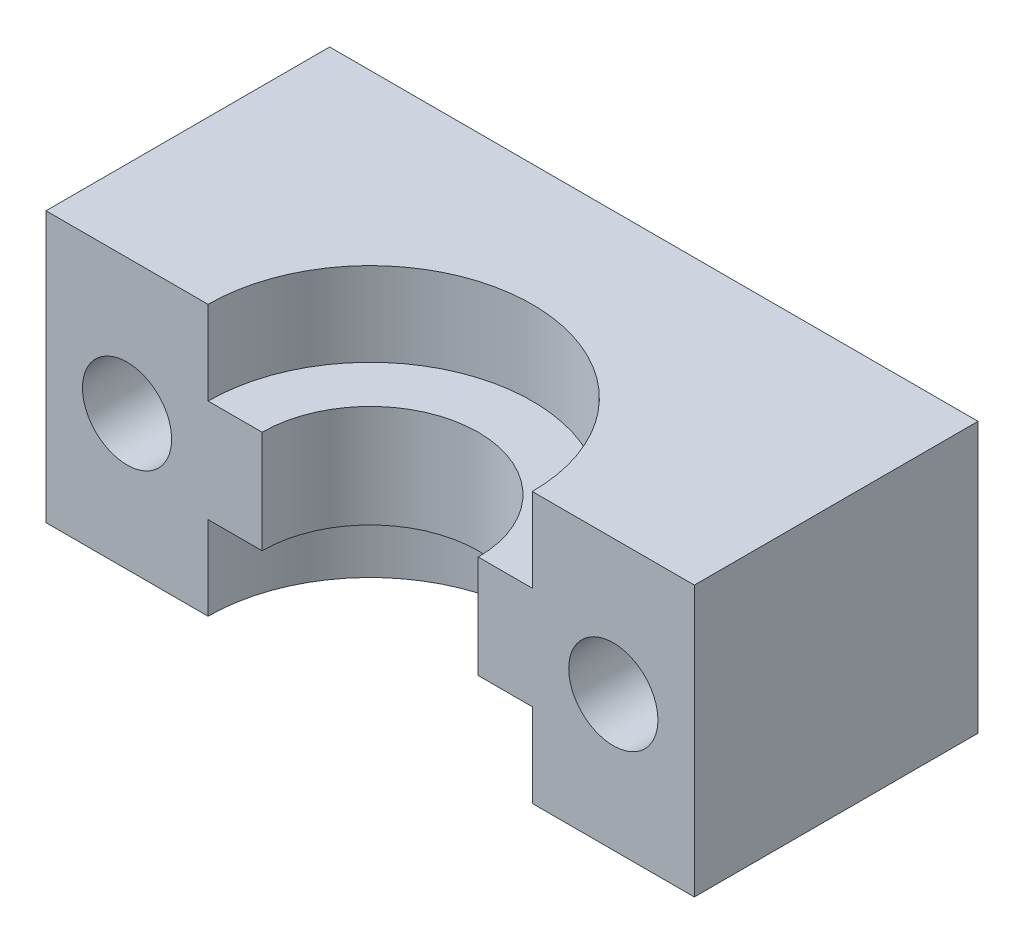
ISO-10303-21;
HEADER;
FILE_DESCRIPTION(('STEP AP214'),'2;1');
FILE_NAME('part.step','',(''),(''),'','','');
FILE_SCHEMA(('AUTOMOTIVE_DESIGN { 1 0 10303 214 1 1 1 1 }'));
ENDSEC;
DATA;
#1=APPLICATION_CONTEXT('core data for automotive mechanical design processes');
#2=APPLICATION_PROTOCOL_DEFINITION('international standard','automotive_design',2000,#1);
#3=PRODUCT_CONTEXT('',#1,'mechanical');
#4=PRODUCT('Part','Part','',(#3));
#5=PRODUCT_RELATED_PRODUCT_CATEGORY('part','',(#4));
#6=PRODUCT_DEFINITION_FORMATION('','',#4);
#7=PRODUCT_DEFINITION_CONTEXT('part definition',#1,'design');
#8=PRODUCT_DEFINITION('design','',#6,#7);
#9=PRODUCT_DEFINITION_SHAPE('','',#8);
#10=(LENGTH_UNIT() NAMED_UNIT(*) SI_UNIT(.MILLI.,.METRE.));
#11=(NAMED_UNIT(*) PLANE_ANGLE_UNIT() SI_UNIT($,.RADIAN.));
#12=(NAMED_UNIT(*) SI_UNIT($,.STERADIAN.) SOLID_ANGLE_UNIT());
#13=UNCERTAINTY_MEASURE_WITH_UNIT(LENGTH_MEASURE(1.E-05),#10,'distance_accuracy_value','');
#14=(GEOMETRIC_REPRESENTATION_CONTEXT(3) GLOBAL_UNCERTAINTY_ASSIGNED_CONTEXT((#13)) GLOBAL_UNIT_ASSIGNED_CONTEXT((#10,
#11,#12)) REPRESENTATION_CONTEXT('',''));
#15=CARTESIAN_POINT('',(0.,0.,0.));
#16=DIRECTION('',(0.,0.,1.));
#17=DIRECTION('',(1.,0.,0.));
#18=AXIS2_PLACEMENT_3D('',#15,#16,#17);
#19=CARTESIAN_POINT('',(0.,0.,10.5));
#20=DIRECTION('',(0.,0.,1.));
#21=DIRECTION('',(1.,0.,0.));
#22=AXIS2_PLACEMENT_3D('',#19,#20,#21);
#23=PLANE('',#22);
#24=DIRECTION('',(0.,-1.,0.));
#25=VECTOR('',#24,1.);
#26=CARTESIAN_POINT('',(-6.,5.06281934360466,10.5));
#27=LINE('',#26,#25);
#28=CARTESIAN_POINT('',(-6.,5.,10.5));
#29=VERTEX_POINT('',#28);
#30=CARTESIAN_POINT('',(-6.,1.9,10.5));
#31=VERTEX_POINT('',#30);
#32=EDGE_CURVE('E159',#29,#31,#27,.T.);
#33=ORIENTED_EDGE('',*,*,#32,.F.);
#34=DIRECTION('',(-1.,0.,0.));
#35=VECTOR('',#34,1.);
#36=CARTESIAN_POINT('',(-12.,5.,10.5));
#37=LINE('',#36,#35);
#38=CARTESIAN_POINT('',(-12.,5.,10.5));
#39=VERTEX_POINT('',#38);
#40=EDGE_CURVE('E180',#29,#39,#37,.T.);
#41=ORIENTED_EDGE('',*,*,#40,.T.);
#42=DIRECTION('',(0.,-1.,0.));
#43=VECTOR('',#42,1.);
#44=CARTESIAN_POINT('',(-12.,5.,10.5));
#45=LINE('',#44,#43);
#46=CARTESIAN_POINT('',(-12.,-5.,10.5));
#47=VERTEX_POINT('',#46);
#48=EDGE_CURVE('E182',#39,#47,#45,.T.);
#49=ORIENTED_EDGE('',*,*,#48,.T.);
#50=DIRECTION('',(1.,0.,0.));
#51=VECTOR('',#50,1.);
#52=CARTESIAN_POINT('',(-12.,-5.,10.5));
#53=LINE('',#52,#51);
#54=CARTESIAN_POINT('',(-6.,-5.,10.5));
#55=VERTEX_POINT('',#54);
#56=EDGE_CURVE('E184',#47,#55,#53,.T.);
#57=ORIENTED_EDGE('',*,*,#56,.T.);
#58=DIRECTION('',(0.,-1.,0.));
#59=VECTOR('',#58,1.);
#60=CARTESIAN_POINT('',(-6.,5.06281934360466,10.5));
#61=LINE('',#60,#59);
#62=CARTESIAN_POINT('',(-6.,-1.9,10.5));
#63=VERTEX_POINT('',#62);
#64=EDGE_CURVE('E49',#63,#55,#61,.T.);
#65=ORIENTED_EDGE('',*,*,#64,.F.);
#66=DIRECTION('',(-1.,0.,0.));
#67=VECTOR('',#66,1.);
#68=CARTESIAN_POINT('',(0.,-1.9,10.5));
#69=LINE('',#68,#67);
#70=CARTESIAN_POINT('',(-4.,-1.9,10.5));
#71=VERTEX_POINT('',#70);
#72=EDGE_CURVE('E134',#71,#63,#69,.T.);
#73=ORIENTED_EDGE('',*,*,#72,.F.);
#74=DIRECTION('',(0.,-1.,0.));
#75=VECTOR('',#74,1.);
#76=CARTESIAN_POINT('',(-4.,5.06281934360466,10.5));
#77=LINE('',#76,#75);
#78=CARTESIAN_POINT('',(-4.,1.9,10.5));
#79=VERTEX_POINT('',#78);
#80=EDGE_CURVE('E37',#79,#71,#77,.T.);
#81=ORIENTED_EDGE('',*,*,#80,.F.);
#82=DIRECTION('',(1.,0.,0.));
#83=VECTOR('',#82,1.);
#84=CARTESIAN_POINT('',(0.,1.9,10.5));
#85=LINE('',#84,#83);
#86=EDGE_CURVE('E11',#31,#79,#85,.T.);
#87=ORIENTED_EDGE('',*,*,#86,.F.);
#88=EDGE_LOOP('',(#33,#41,#49,#57,#65,#73,#81,#87));
#89=FACE_BOUND('',#88,.T.);
#90=CARTESIAN_POINT('',(-9.,0.,10.5));
#91=DIRECTION('',(0.,0.,1.));
#92=DIRECTION('',(1.,0.,0.));
#93=AXIS2_PLACEMENT_3D('',#90,#91,#92);
#94=CIRCLE('',#93,1.65);
#95=CARTESIAN_POINT('',(-10.65,0.,10.5));
#96=VERTEX_POINT('',#95);
#97=EDGE_CURVE('E172',#96,#96,#94,.T.);
#98=ORIENTED_EDGE('',*,*,#97,.F.);
#99=EDGE_LOOP('',(#98));
#100=FACE_BOUND('',#99,.T.);
#101=ADVANCED_FACE('F33',(#89,#100),#23,.T.);
#102=DIRECTION('',(0.,-1.,0.));
#103=VECTOR('',#102,1.);
#104=CARTESIAN_POINT('',(6.,5.06281934360466,10.5));
#105=LINE('',#104,#103);
#106=CARTESIAN_POINT('',(6.,1.9,10.5));
#107=VERTEX_POINT('',#106);
#108=CARTESIAN_POINT('',(6.,5.,10.5));
#109=VERTEX_POINT('',#108);
#110=EDGE_CURVE('E157',#107,#109,#105,.F.);
#111=ORIENTED_EDGE('',*,*,#110,.F.);
#112=CARTESIAN_POINT('',(4.,1.9,10.5));
#113=VERTEX_POINT('',#112);
#114=EDGE_CURVE('E42',#113,#107,#85,.T.);
#115=ORIENTED_EDGE('',*,*,#114,.F.);
#116=DIRECTION('',(0.,-1.,0.));
#117=VECTOR('',#116,1.);
#118=CARTESIAN_POINT('',(4.,5.06281934360466,10.5));
#119=LINE('',#118,#117);
#120=CARTESIAN_POINT('',(4.,-1.9,10.5));
#121=VERTEX_POINT('',#120);
#122=EDGE_CURVE('E142',#121,#113,#119,.F.);
#123=ORIENTED_EDGE('',*,*,#122,.F.);
#124=CARTESIAN_POINT('',(6.,-1.9,10.5));
#125=VERTEX_POINT('',#124);
#126=EDGE_CURVE('E131',#125,#121,#69,.T.);
#127=ORIENTED_EDGE('',*,*,#126,.F.);
#128=DIRECTION('',(0.,-1.,0.));
#129=VECTOR('',#128,1.);
#130=CARTESIAN_POINT('',(6.,5.06281934360466,10.5));
#131=LINE('',#130,#129);
#132=CARTESIAN_POINT('',(6.,-5.,10.5));
#133=VERTEX_POINT('',#132);
#134=EDGE_CURVE('E120',#133,#125,#131,.F.);
#135=ORIENTED_EDGE('',*,*,#134,.F.);
#136=CARTESIAN_POINT('',(12.,-5.,10.5));
#137=VERTEX_POINT('',#136);
#138=EDGE_CURVE('E58',#133,#137,#53,.T.);
#139=ORIENTED_EDGE('',*,*,#138,.T.);
#140=DIRECTION('',(0.,1.,0.));
#141=VECTOR('',#140,1.);
#142=CARTESIAN_POINT('',(12.,5.,10.5));
#143=LINE('',#142,#141);
#144=CARTESIAN_POINT('',(12.,5.,10.5));
#145=VERTEX_POINT('',#144);
#146=EDGE_CURVE('E178',#137,#145,#143,.T.);
#147=ORIENTED_EDGE('',*,*,#146,.T.);
#148=EDGE_CURVE('E88',#145,#109,#37,.T.);
#149=ORIENTED_EDGE('',*,*,#148,.T.);
#150=EDGE_LOOP('',(#111,#115,#123,#127,#135,#139,#147,#149));
#151=FACE_BOUND('',#150,.T.);
#152=CARTESIAN_POINT('',(9.,0.,10.5));
#153=DIRECTION('',(0.,0.,1.));
#154=DIRECTION('',(1.,0.,0.));
#155=AXIS2_PLACEMENT_3D('',#152,#153,#154);
#156=CIRCLE('',#155,1.65);
#157=CARTESIAN_POINT('',(7.35,0.,10.5));
#158=VERTEX_POINT('',#157);
#159=EDGE_CURVE('E166',#158,#158,#156,.T.);
#160=ORIENTED_EDGE('',*,*,#159,.F.);
#161=EDGE_LOOP('',(#160));
#162=FACE_BOUND('',#161,.T.);
#163=ADVANCED_FACE('F139',(#151,#162),#23,.T.);
#164=CARTESIAN_POINT('',(0.,0.,0.));
#165=DIRECTION('',(0.,0.,1.));
#166=DIRECTION('',(1.,0.,0.));
#167=AXIS2_PLACEMENT_3D('',#164,#165,#166);
#168=PLANE('',#167);
#169=DIRECTION('',(0.,1.,0.));
#170=VECTOR('',#169,1.);
#171=CARTESIAN_POINT('',(12.,5.,0.));
#172=LINE('',#171,#170);
#173=CARTESIAN_POINT('',(12.,-5.,0.));
#174=VERTEX_POINT('',#173);
#175=CARTESIAN_POINT('',(12.,5.,0.));
#176=VERTEX_POINT('',#175);
#177=EDGE_CURVE('E175',#174,#176,#172,.T.);
#178=ORIENTED_EDGE('',*,*,#177,.F.);
#179=DIRECTION('',(1.,0.,0.));
#180=VECTOR('',#179,1.);
#181=CARTESIAN_POINT('',(-12.,-5.,0.));
#182=LINE('',#181,#180);
#183=CARTESIAN_POINT('',(-12.,-5.,0.));
#184=VERTEX_POINT('',#183);
#185=EDGE_CURVE('E80',#184,#174,#182,.T.);
#186=ORIENTED_EDGE('',*,*,#185,.F.);
#187=DIRECTION('',(0.,-1.,0.));
#188=VECTOR('',#187,1.);
#189=CARTESIAN_POINT('',(-12.,5.,0.));
#190=LINE('',#189,#188);
#191=CARTESIAN_POINT('',(-12.,5.,0.));
#192=VERTEX_POINT('',#191);
#193=EDGE_CURVE('E192',#192,#184,#190,.T.);
#194=ORIENTED_EDGE('',*,*,#193,.F.);
#195=DIRECTION('',(-1.,0.,0.));
#196=VECTOR('',#195,1.);
#197=CARTESIAN_POINT('',(-12.,5.,0.));
#198=LINE('',#197,#196);
#199=EDGE_CURVE('E190',#176,#192,#198,.T.);
#200=ORIENTED_EDGE('',*,*,#199,.F.);
#201=EDGE_LOOP('',(#178,#186,#194,#200));
#202=FACE_BOUND('',#201,.T.);
#203=CARTESIAN_POINT('',(-9.,0.,0.));
#204=DIRECTION('',(0.,0.,1.));
#205=DIRECTION('',(1.,0.,0.));
#206=AXIS2_PLACEMENT_3D('',#203,#204,#205);
#207=CIRCLE('',#206,1.65);
#208=CARTESIAN_POINT('',(-10.65,0.,0.));
#209=VERTEX_POINT('',#208);
#210=EDGE_CURVE('E169',#209,#209,#207,.T.);
#211=ORIENTED_EDGE('',*,*,#210,.T.);
#212=EDGE_LOOP('',(#211));
#213=FACE_BOUND('',#212,.T.);
#214=CARTESIAN_POINT('',(9.,0.,0.));
#215=DIRECTION('',(0.,0.,1.));
#216=DIRECTION('',(1.,0.,0.));
#217=AXIS2_PLACEMENT_3D('',#214,#215,#216);
#218=CIRCLE('',#217,1.65);
#219=CARTESIAN_POINT('',(7.35,0.,0.));
#220=VERTEX_POINT('',#219);
#221=EDGE_CURVE('E162',#220,#220,#218,.T.);
#222=ORIENTED_EDGE('',*,*,#221,.T.);
#223=EDGE_LOOP('',(#222));
#224=FACE_BOUND('',#223,.T.);
#225=ADVANCED_FACE('F216',(#202,#213,#224),#168,.F.);
#226=CARTESIAN_POINT('',(12.,5.,10.5));
#227=DIRECTION('',(-1.,0.,0.));
#228=DIRECTION('',(0.,0.,1.));
#229=AXIS2_PLACEMENT_3D('',#226,#227,#228);
#230=PLANE('',#229);
#231=ORIENTED_EDGE('',*,*,#177,.T.);
#232=DIRECTION('',(0.,0.,-1.));
#233=VECTOR('',#232,1.);
#234=CARTESIAN_POINT('',(12.,5.,10.5));
#235=LINE('',#234,#233);
#236=EDGE_CURVE('E201',#145,#176,#235,.T.);
#237=ORIENTED_EDGE('',*,*,#236,.F.);
#238=ORIENTED_EDGE('',*,*,#146,.F.);
#239=DIRECTION('',(0.,0.,-1.));
#240=VECTOR('',#239,1.);
#241=CARTESIAN_POINT('',(12.,-5.,10.5));
#242=LINE('',#241,#240);
#243=EDGE_CURVE('E187',#137,#174,#242,.T.);
#244=ORIENTED_EDGE('',*,*,#243,.T.);
#245=EDGE_LOOP('',(#231,#237,#238,#244));
#246=FACE_BOUND('',#245,.T.);
#247=ADVANCED_FACE('F35',(#246),#230,.F.);
#248=CARTESIAN_POINT('',(-12.,5.,10.5));
#249=DIRECTION('',(0.,-1.,0.));
#250=DIRECTION('',(0.,0.,-1.));
#251=AXIS2_PLACEMENT_3D('',#248,#249,#250);
#252=PLANE('',#251);
#253=ORIENTED_EDGE('',*,*,#40,.F.);
#254=CARTESIAN_POINT('',(0.,5.,10.5));
#255=DIRECTION('',(0.,-1.,0.));
#256=DIRECTION('',(0.,0.,-1.));
#257=AXIS2_PLACEMENT_3D('',#254,#255,#256);
#258=CIRCLE('',#257,6.);
#259=EDGE_CURVE('E143',#29,#109,#258,.T.);
#260=ORIENTED_EDGE('',*,*,#259,.T.);
#261=ORIENTED_EDGE('',*,*,#148,.F.);
#262=ORIENTED_EDGE('',*,*,#236,.T.);
#263=ORIENTED_EDGE('',*,*,#199,.T.);
#264=DIRECTION('',(0.,0.,-1.));
#265=VECTOR('',#264,1.);
#266=CARTESIAN_POINT('',(-12.,5.,10.5));
#267=LINE('',#266,#265);
#268=EDGE_CURVE('E198',#39,#192,#267,.T.);
#269=ORIENTED_EDGE('',*,*,#268,.F.);
#270=EDGE_LOOP('',(#253,#260,#261,#262,#263,#269));
#271=FACE_BOUND('',#270,.T.);
#272=ADVANCED_FACE('F221',(#271),#252,.F.);
#273=CARTESIAN_POINT('',(-12.,5.,10.5));
#274=DIRECTION('',(1.,0.,0.));
#275=DIRECTION('',(0.,1.,0.));
#276=AXIS2_PLACEMENT_3D('',#273,#274,#275);
#277=PLANE('',#276);
#278=ORIENTED_EDGE('',*,*,#193,.T.);
#279=DIRECTION('',(0.,0.,-1.));
#280=VECTOR('',#279,1.);
#281=CARTESIAN_POINT('',(-12.,-5.,10.5));
#282=LINE('',#281,#280);
#283=EDGE_CURVE('E196',#47,#184,#282,.T.);
#284=ORIENTED_EDGE('',*,*,#283,.F.);
#285=ORIENTED_EDGE('',*,*,#48,.F.);
#286=ORIENTED_EDGE('',*,*,#268,.T.);
#287=EDGE_LOOP('',(#278,#284,#285,#286));
#288=FACE_BOUND('',#287,.T.);
#289=ADVANCED_FACE('F212',(#288),#277,.F.);
#290=CARTESIAN_POINT('',(-12.,-5.,10.5));
#291=DIRECTION('',(0.,1.,0.));
#292=DIRECTION('',(0.,0.,1.));
#293=AXIS2_PLACEMENT_3D('',#290,#291,#292);
#294=PLANE('',#293);
#295=ORIENTED_EDGE('',*,*,#138,.F.);
#296=CARTESIAN_POINT('',(0.,-5.,10.5));
#297=DIRECTION('',(0.,1.,0.));
#298=DIRECTION('',(0.,0.,1.));
#299=AXIS2_PLACEMENT_3D('',#296,#297,#298);
#300=CIRCLE('',#299,6.);
#301=EDGE_CURVE('E124',#133,#55,#300,.T.);
#302=ORIENTED_EDGE('',*,*,#301,.T.);
#303=ORIENTED_EDGE('',*,*,#56,.F.);
#304=ORIENTED_EDGE('',*,*,#283,.T.);
#305=ORIENTED_EDGE('',*,*,#185,.T.);
#306=ORIENTED_EDGE('',*,*,#243,.F.);
#307=EDGE_LOOP('',(#295,#302,#303,#304,#305,#306));
#308=FACE_BOUND('',#307,.T.);
#309=ADVANCED_FACE('F204',(#308),#294,.F.);
#310=CARTESIAN_POINT('',(-9.,0.,10.5));
#311=DIRECTION('',(0.,0.,-1.));
#312=DIRECTION('',(-1.,0.,0.));
#313=AXIS2_PLACEMENT_3D('',#310,#311,#312);
#314=CYLINDRICAL_SURFACE('',#313,1.65);
#315=CARTESIAN_POINT('',(-10.65,0.,10.5));
#316=CARTESIAN_POINT('',(-10.65,0.,10.390625));
#317=CARTESIAN_POINT('',(-10.65,0.,10.28125));
#318=CARTESIAN_POINT('',(-10.65,0.,10.0625));
#319=CARTESIAN_POINT('',(-10.65,0.,9.953125));
#320=CARTESIAN_POINT('',(-10.65,0.,9.734375));
#321=CARTESIAN_POINT('',(-10.65,0.,9.625));
#322=CARTESIAN_POINT('',(-10.65,0.,9.40625));
#323=CARTESIAN_POINT('',(-10.65,0.,9.296875));
#324=CARTESIAN_POINT('',(-10.65,0.,9.078125));
#325=CARTESIAN_POINT('',(-10.65,0.,8.96875));
#326=CARTESIAN_POINT('',(-10.65,0.,8.75));
#327=CARTESIAN_POINT('',(-10.65,0.,8.640625));
#328=CARTESIAN_POINT('',(-10.65,0.,8.421875));
#329=CARTESIAN_POINT('',(-10.65,0.,8.3125));
#330=CARTESIAN_POINT('',(-10.65,0.,8.09375));
#331=CARTESIAN_POINT('',(-10.65,0.,7.984375));
#332=CARTESIAN_POINT('',(-10.65,0.,7.765625));
#333=CARTESIAN_POINT('',(-10.65,0.,7.65625));
#334=CARTESIAN_POINT('',(-10.65,0.,7.4375));
#335=CARTESIAN_POINT('',(-10.65,0.,7.328125));
#336=CARTESIAN_POINT('',(-10.65,0.,7.109375));
#337=CARTESIAN_POINT('',(-10.65,0.,7.));
#338=CARTESIAN_POINT('',(-10.65,0.,6.78125));
#339=CARTESIAN_POINT('',(-10.65,0.,6.671875));
#340=CARTESIAN_POINT('',(-10.65,0.,6.453125));
#341=CARTESIAN_POINT('',(-10.65,0.,6.34375));
#342=CARTESIAN_POINT('',(-10.65,0.,6.125));
#343=CARTESIAN_POINT('',(-10.65,0.,6.015625));
#344=CARTESIAN_POINT('',(-10.65,0.,5.796875));
#345=CARTESIAN_POINT('',(-10.65,0.,5.6875));
#346=CARTESIAN_POINT('',(-10.65,0.,5.46875));
#347=CARTESIAN_POINT('',(-10.65,0.,5.359375));
#348=CARTESIAN_POINT('',(-10.65,0.,5.140625));
#349=CARTESIAN_POINT('',(-10.65,0.,5.03125));
#350=CARTESIAN_POINT('',(-10.65,0.,4.8125));
#351=CARTESIAN_POINT('',(-10.65,0.,4.703125));
#352=CARTESIAN_POINT('',(-10.65,0.,4.484375));
#353=CARTESIAN_POINT('',(-10.65,0.,4.375));
#354=CARTESIAN_POINT('',(-10.65,0.,4.15625));
#355=CARTESIAN_POINT('',(-10.65,0.,4.046875));
#356=CARTESIAN_POINT('',(-10.65,0.,3.828125));
#357=CARTESIAN_POINT('',(-10.65,0.,3.71875));
#358=CARTESIAN_POINT('',(-10.65,0.,3.5));
#359=CARTESIAN_POINT('',(-10.65,0.,3.390625));
#360=CARTESIAN_POINT('',(-10.65,0.,3.171875));
#361=CARTESIAN_POINT('',(-10.65,0.,3.0625));
#362=CARTESIAN_POINT('',(-10.65,0.,2.84375));
#363=CARTESIAN_POINT('',(-10.65,0.,2.734375));
#364=CARTESIAN_POINT('',(-10.65,0.,2.515625));
#365=CARTESIAN_POINT('',(-10.65,0.,2.40625));
#366=CARTESIAN_POINT('',(-10.65,0.,2.1875));
#367=CARTESIAN_POINT('',(-10.65,0.,2.078125));
#368=CARTESIAN_POINT('',(-10.65,0.,1.859375));
#369=CARTESIAN_POINT('',(-10.65,0.,1.75));
#370=CARTESIAN_POINT('',(-10.65,0.,1.53125));
#371=CARTESIAN_POINT('',(-10.65,0.,1.421875));
#372=CARTESIAN_POINT('',(-10.65,0.,1.203125));
#373=CARTESIAN_POINT('',(-10.65,0.,1.09375));
#374=CARTESIAN_POINT('',(-10.65,0.,0.875000000000001));
#375=CARTESIAN_POINT('',(-10.65,0.,0.765625000000001));
#376=CARTESIAN_POINT('',(-10.65,0.,0.546875));
#377=CARTESIAN_POINT('',(-10.65,0.,0.4375));
#378=CARTESIAN_POINT('',(-10.65,0.,0.21875));
#379=CARTESIAN_POINT('',(-10.65,0.,0.109375));
#380=CARTESIAN_POINT('',(-10.65,0.,0.));
#381=B_SPLINE_CURVE_WITH_KNOTS('',3,(#315,#316,#317,#318,#319,#320,#321,#322,#323,#324,#325,
#326,#327,#328,#329,#330,#331,#332,#333,#334,#335,#336,#337,#338,#339,#340,#341,#342,#343,#344,
#345,#346,#347,#348,#349,#350,#351,#352,#353,#354,#355,#356,#357,#358,#359,#360,#361,#362,#363,
#364,#365,#366,#367,#368,#369,#370,#371,#372,#373,#374,#375,#376,#377,#378,#379,#380),
.UNSPECIFIED.,.F.,.F.,(4,2,2,2,2,2,2,2,2,2,2,2,2,2,2,2,2,2,2,2,2,2,2,2,2,2,2,2,2,2,2,2,4),(0.,
0.328124999999999,0.656249999999999,0.984374999999999,1.3125,1.640625,1.96875,2.296875,2.625,
2.953125,3.28125,3.609375,3.9375,4.265625,4.59375,4.921875,5.25,5.578125,5.90625,6.234375,
6.5625,6.890625,7.21875,7.546875,7.875,8.203125,8.53125,8.859375,9.1875,9.515625,9.84375,
10.171875,10.5),.UNSPECIFIED.);
#382=EDGE_CURVE('BSEAM243',#96,#209,#381,.T.);
#383=ORIENTED_EDGE('',*,*,#97,.T.);
#384=ORIENTED_EDGE('',*,*,#210,.F.);
#385=ORIENTED_EDGE('',*,*,#382,.T.);
#386=ORIENTED_EDGE('',*,*,#382,.F.);
#387=EDGE_LOOP('',(#383,#385,#384,#386));
#388=FACE_BOUND('',#387,.T.);
#389=ADVANCED_FACE('F243',(#388),#314,.F.);
#390=CARTESIAN_POINT('',(9.,0.,10.5));
#391=DIRECTION('',(0.,0.,-1.));
#392=DIRECTION('',(-1.,0.,0.));
#393=AXIS2_PLACEMENT_3D('',#390,#391,#392);
#394=CYLINDRICAL_SURFACE('',#393,1.65);
#395=CARTESIAN_POINT('',(7.35,0.,10.5));
#396=CARTESIAN_POINT('',(7.35,0.,10.390625));
#397=CARTESIAN_POINT('',(7.35,0.,10.28125));
#398=CARTESIAN_POINT('',(7.35,0.,10.0625));
#399=CARTESIAN_POINT('',(7.35,0.,9.953125));
#400=CARTESIAN_POINT('',(7.35,0.,9.734375));
#401=CARTESIAN_POINT('',(7.35,0.,9.625));
#402=CARTESIAN_POINT('',(7.35,0.,9.40625));
#403=CARTESIAN_POINT('',(7.35,0.,9.296875));
#404=CARTESIAN_POINT('',(7.35,0.,9.078125));
#405=CARTESIAN_POINT('',(7.35,0.,8.96875));
#406=CARTESIAN_POINT('',(7.35,0.,8.75));
#407=CARTESIAN_POINT('',(7.35,0.,8.640625));
#408=CARTESIAN_POINT('',(7.35,0.,8.421875));
#409=CARTESIAN_POINT('',(7.35,0.,8.3125));
#410=CARTESIAN_POINT('',(7.35,0.,8.09375));
#411=CARTESIAN_POINT('',(7.35,0.,7.984375));
#412=CARTESIAN_POINT('',(7.35,0.,7.765625));
#413=CARTESIAN_POINT('',(7.35,0.,7.65625));
#414=CARTESIAN_POINT('',(7.35,0.,7.4375));
#415=CARTESIAN_POINT('',(7.35,0.,7.328125));
#416=CARTESIAN_POINT('',(7.35,0.,7.109375));
#417=CARTESIAN_POINT('',(7.35,0.,7.));
#418=CARTESIAN_POINT('',(7.35,0.,6.78125));
#419=CARTESIAN_POINT('',(7.35,0.,6.671875));
#420=CARTESIAN_POINT('',(7.35,0.,6.453125));
#421=CARTESIAN_POINT('',(7.35,0.,6.34375));
#422=CARTESIAN_POINT('',(7.35,0.,6.125));
#423=CARTESIAN_POINT('',(7.35,0.,6.015625));
#424=CARTESIAN_POINT('',(7.35,0.,5.796875));
#425=CARTESIAN_POINT('',(7.35,0.,5.6875));
#426=CARTESIAN_POINT('',(7.35,0.,5.46875));
#427=CARTESIAN_POINT('',(7.35,0.,5.359375));
#428=CARTESIAN_POINT('',(7.35,0.,5.140625));
#429=CARTESIAN_POINT('',(7.35,0.,5.03125));
#430=CARTESIAN_POINT('',(7.35,0.,4.8125));
#431=CARTESIAN_POINT('',(7.35,0.,4.703125));
#432=CARTESIAN_POINT('',(7.35,0.,4.484375));
#433=CARTESIAN_POINT('',(7.35,0.,4.375));
#434=CARTESIAN_POINT('',(7.35,0.,4.15625));
#435=CARTESIAN_POINT('',(7.35,0.,4.046875));
#436=CARTESIAN_POINT('',(7.35,0.,3.828125));
#437=CARTESIAN_POINT('',(7.35,0.,3.71875));
#438=CARTESIAN_POINT('',(7.35,0.,3.5));
#439=CARTESIAN_POINT('',(7.35,0.,3.390625));
#440=CARTESIAN_POINT('',(7.35,0.,3.171875));
#441=CARTESIAN_POINT('',(7.35,0.,3.0625));
#442=CARTESIAN_POINT('',(7.35,0.,2.84375));
#443=CARTESIAN_POINT('',(7.35,0.,2.734375));
#444=CARTESIAN_POINT('',(7.35,0.,2.515625));
#445=CARTESIAN_POINT('',(7.35,0.,2.40625));
#446=CARTESIAN_POINT('',(7.35,0.,2.1875));
#447=CARTESIAN_POINT('',(7.35,0.,2.078125));
#448=CARTESIAN_POINT('',(7.35,0.,1.859375));
#449=CARTESIAN_POINT('',(7.35,0.,1.75));
#450=CARTESIAN_POINT('',(7.35,0.,1.53125));
#451=CARTESIAN_POINT('',(7.35,0.,1.421875));
#452=CARTESIAN_POINT('',(7.35,0.,1.203125));
#453=CARTESIAN_POINT('',(7.35,0.,1.09375));
#454=CARTESIAN_POINT('',(7.35,0.,0.875000000000001));
#455=CARTESIAN_POINT('',(7.35,0.,0.765625000000001));
#456=CARTESIAN_POINT('',(7.35,0.,0.546875));
#457=CARTESIAN_POINT('',(7.35,0.,0.4375));
#458=CARTESIAN_POINT('',(7.35,0.,0.21875));
#459=CARTESIAN_POINT('',(7.35,0.,0.109375));
#460=CARTESIAN_POINT('',(7.35,0.,0.));
#461=B_SPLINE_CURVE_WITH_KNOTS('',3,(#395,#396,#397,#398,#399,#400,#401,#402,#403,#404,#405,
#406,#407,#408,#409,#410,#411,#412,#413,#414,#415,#416,#417,#418,#419,#420,#421,#422,#423,#424,
#425,#426,#427,#428,#429,#430,#431,#432,#433,#434,#435,#436,#437,#438,#439,#440,#441,#442,#443,
#444,#445,#446,#447,#448,#449,#450,#451,#452,#453,#454,#455,#456,#457,#458,#459,#460),
.UNSPECIFIED.,.F.,.F.,(4,2,2,2,2,2,2,2,2,2,2,2,2,2,2,2,2,2,2,2,2,2,2,2,2,2,2,2,2,2,2,2,4),(0.,
0.328124999999999,0.656249999999999,0.984374999999999,1.3125,1.640625,1.96875,2.296875,2.625,
2.953125,3.28125,3.609375,3.9375,4.265625,4.59375,4.921875,5.25,5.578125,5.90625,6.234375,
6.5625,6.890625,7.21875,7.546875,7.875,8.203125,8.53125,8.859375,9.1875,9.515625,9.84375,
10.171875,10.5),.UNSPECIFIED.);
#462=EDGE_CURVE('BSEAM234',#158,#220,#461,.T.);
#463=ORIENTED_EDGE('',*,*,#159,.T.);
#464=ORIENTED_EDGE('',*,*,#221,.F.);
#465=ORIENTED_EDGE('',*,*,#462,.T.);
#466=ORIENTED_EDGE('',*,*,#462,.F.);
#467=EDGE_LOOP('',(#463,#465,#464,#466));
#468=FACE_BOUND('',#467,.T.);
#469=ADVANCED_FACE('F234',(#468),#394,.F.);
#470=CARTESIAN_POINT('',(0.,-1.9,4.5));
#471=DIRECTION('',(0.,1.,0.));
#472=DIRECTION('',(0.,0.,1.));
#473=AXIS2_PLACEMENT_3D('',#470,#471,#472);
#474=PLANE('',#473);
#475=ORIENTED_EDGE('',*,*,#126,.T.);
#476=CARTESIAN_POINT('',(0.,-1.9,10.5));
#477=DIRECTION('',(0.,-1.,0.));
#478=DIRECTION('',(0.,0.,-1.));
#479=AXIS2_PLACEMENT_3D('',#476,#477,#478);
#480=CIRCLE('',#479,4.);
#481=EDGE_CURVE('E126',#71,#121,#480,.T.);
#482=ORIENTED_EDGE('',*,*,#481,.F.);
#483=ORIENTED_EDGE('',*,*,#72,.T.);
#484=CARTESIAN_POINT('',(0.,-1.9,10.5));
#485=DIRECTION('',(0.,-1.,0.));
#486=DIRECTION('',(0.,0.,-1.));
#487=AXIS2_PLACEMENT_3D('',#484,#485,#486);
#488=CIRCLE('',#487,6.);
#489=EDGE_CURVE('E123',#63,#125,#488,.T.);
#490=ORIENTED_EDGE('',*,*,#489,.T.);
#491=EDGE_LOOP('',(#475,#482,#483,#490));
#492=FACE_BOUND('',#491,.T.);
#493=ADVANCED_FACE('F129',(#492),#474,.F.);
#494=CARTESIAN_POINT('',(0.,5.06281934360466,10.5));
#495=DIRECTION('',(0.,-1.,0.));
#496=DIRECTION('',(0.,0.,-1.));
#497=AXIS2_PLACEMENT_3D('',#494,#495,#496);
#498=CYLINDRICAL_SURFACE('',#497,4.);
#499=ORIENTED_EDGE('',*,*,#80,.T.);
#500=ORIENTED_EDGE('',*,*,#481,.T.);
#501=ORIENTED_EDGE('',*,*,#122,.T.);
#502=CARTESIAN_POINT('',(0.,1.9,10.5));
#503=DIRECTION('',(0.,-1.,0.));
#504=DIRECTION('',(0.,0.,-1.));
#505=AXIS2_PLACEMENT_3D('',#502,#503,#504);
#506=CIRCLE('',#505,4.);
#507=EDGE_CURVE('E154',#79,#113,#506,.T.);
#508=ORIENTED_EDGE('',*,*,#507,.F.);
#509=EDGE_LOOP('',(#499,#500,#501,#508));
#510=FACE_BOUND('',#509,.T.);
#511=ADVANCED_FACE('F224',(#510),#498,.F.);
#512=CARTESIAN_POINT('',(0.,1.9,6.5));
#513=DIRECTION('',(0.,-1.,0.));
#514=DIRECTION('',(0.,0.,-1.));
#515=AXIS2_PLACEMENT_3D('',#512,#513,#514);
#516=PLANE('',#515);
#517=ORIENTED_EDGE('',*,*,#86,.T.);
#518=ORIENTED_EDGE('',*,*,#507,.T.);
#519=ORIENTED_EDGE('',*,*,#114,.T.);
#520=CARTESIAN_POINT('',(0.,1.9,10.5));
#521=DIRECTION('',(0.,-1.,0.));
#522=DIRECTION('',(0.,0.,-1.));
#523=AXIS2_PLACEMENT_3D('',#520,#521,#522);
#524=CIRCLE('',#523,6.);
#525=EDGE_CURVE('E135',#31,#107,#524,.T.);
#526=ORIENTED_EDGE('',*,*,#525,.F.);
#527=EDGE_LOOP('',(#517,#518,#519,#526));
#528=FACE_BOUND('',#527,.T.);
#529=ADVANCED_FACE('F151',(#528),#516,.F.);
#530=CARTESIAN_POINT('',(0.,5.06281934360466,10.5));
#531=DIRECTION('',(0.,-1.,0.));
#532=DIRECTION('',(0.,0.,-1.));
#533=AXIS2_PLACEMENT_3D('',#530,#531,#532);
#534=CYLINDRICAL_SURFACE('',#533,6.);
#535=ORIENTED_EDGE('',*,*,#32,.T.);
#536=ORIENTED_EDGE('',*,*,#525,.T.);
#537=ORIENTED_EDGE('',*,*,#110,.T.);
#538=ORIENTED_EDGE('',*,*,#259,.F.);
#539=EDGE_LOOP('',(#535,#536,#537,#538));
#540=FACE_BOUND('',#539,.T.);
#541=ADVANCED_FACE('F156',(#540),#534,.F.);
#542=CARTESIAN_POINT('',(0.,5.06281934360466,10.5));
#543=DIRECTION('',(0.,-1.,0.));
#544=DIRECTION('',(0.,0.,-1.));
#545=AXIS2_PLACEMENT_3D('',#542,#543,#544);
#546=CYLINDRICAL_SURFACE('',#545,6.);
#547=ORIENTED_EDGE('',*,*,#64,.T.);
#548=ORIENTED_EDGE('',*,*,#301,.F.);
#549=ORIENTED_EDGE('',*,*,#134,.T.);
#550=ORIENTED_EDGE('',*,*,#489,.F.);
#551=EDGE_LOOP('',(#547,#548,#549,#550));
#552=FACE_BOUND('',#551,.T.);
#553=ADVANCED_FACE('F122',(#552),#546,.F.);
#554=CLOSED_SHELL('',(#101,#163,#225,#247,#272,#289,#309,#389,#469,#493,#511,#529,#541,#553));
#555=MANIFOLD_SOLID_BREP('B2',#554);
#556=ADVANCED_BREP_SHAPE_REPRESENTATION('',(#18,#555),#14);
#557=SHAPE_DEFINITION_REPRESENTATION(#9,#556);
ENDSEC;
END-ISO-10303-21;
